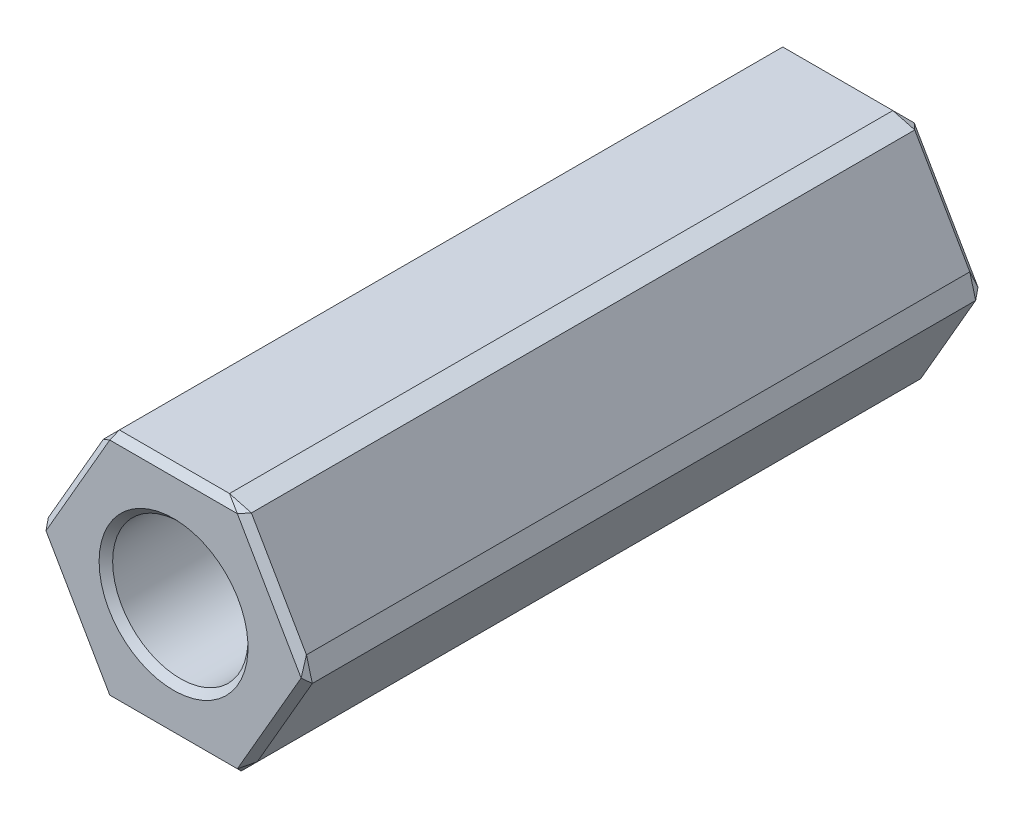
ISO-10303-21;
HEADER;
FILE_DESCRIPTION(('STEP AP214'),'2;1');
FILE_NAME('part.step','',(''),(''),'','','');
FILE_SCHEMA(('AUTOMOTIVE_DESIGN { 1 0 10303 214 1 1 1 1 }'));
ENDSEC;
DATA;
#1=APPLICATION_CONTEXT('core data for automotive mechanical design processes');
#2=APPLICATION_PROTOCOL_DEFINITION('international standard','automotive_design',2000,#1);
#3=PRODUCT_CONTEXT('',#1,'mechanical');
#4=PRODUCT('Part','Part','',(#3));
#5=PRODUCT_RELATED_PRODUCT_CATEGORY('part','',(#4));
#6=PRODUCT_DEFINITION_FORMATION('','',#4);
#7=PRODUCT_DEFINITION_CONTEXT('part definition',#1,'design');
#8=PRODUCT_DEFINITION('design','',#6,#7);
#9=PRODUCT_DEFINITION_SHAPE('','',#8);
#10=(LENGTH_UNIT() NAMED_UNIT(*) SI_UNIT(.MILLI.,.METRE.));
#11=(NAMED_UNIT(*) PLANE_ANGLE_UNIT() SI_UNIT($,.RADIAN.));
#12=(NAMED_UNIT(*) SI_UNIT($,.STERADIAN.) SOLID_ANGLE_UNIT());
#13=UNCERTAINTY_MEASURE_WITH_UNIT(LENGTH_MEASURE(1.E-05),#10,'distance_accuracy_value','');
#14=(GEOMETRIC_REPRESENTATION_CONTEXT(3) GLOBAL_UNCERTAINTY_ASSIGNED_CONTEXT((#13)) GLOBAL_UNIT_ASSIGNED_CONTEXT((#10,
#11,#12)) REPRESENTATION_CONTEXT('',''));
#15=CARTESIAN_POINT('',(0.,0.,0.));
#16=DIRECTION('',(0.,0.,1.));
#17=DIRECTION('',(1.,0.,0.));
#18=AXIS2_PLACEMENT_3D('',#15,#16,#17);
#19=CARTESIAN_POINT('',(0.,0.,20.));
#20=DIRECTION('',(0.,0.,-1.));
#21=DIRECTION('',(-1.,0.,0.));
#22=AXIS2_PLACEMENT_3D('',#19,#20,#21);
#23=PLANE('',#22);
#24=CARTESIAN_POINT('',(-1.04603243970518,3.835452278919,20.));
#25=DIRECTION('',(0.,0.,-1.));
#26=DIRECTION('',(-1.,0.,0.));
#27=AXIS2_PLACEMENT_3D('',#24,#25,#26);
#28=CIRCLE('',#27,2.20000000000001);
#29=CARTESIAN_POINT('',(-3.24603243970519,3.835452278919,20.));
#30=VERTEX_POINT('',#29);
#31=EDGE_CURVE('E11',#30,#30,#28,.T.);
#32=ORIENTED_EDGE('',*,*,#31,.T.);
#33=EDGE_LOOP('',(#32));
#34=FACE_BOUND('',#33,.T.);
#35=DIRECTION('',(-0.500000000000002,-0.866025403784437,0.));
#36=VECTOR('',#35,1.);
#37=CARTESIAN_POINT('',(-5.27211880329538,3.04385921028229,20.));
#38=LINE('',#37,#36);
#39=CARTESIAN_POINT('',(-2.93056238586724,7.09955389405677,20.));
#40=VERTEX_POINT('',#39);
#41=CARTESIAN_POINT('',(-4.81509233202933,3.835452278919,20.));
#42=VERTEX_POINT('',#41);
#43=EDGE_CURVE('E52',#40,#42,#38,.T.);
#44=ORIENTED_EDGE('',*,*,#43,.T.);
#45=DIRECTION('',(0.5,-0.866025403784439,0.));
#46=VECTOR('',#45,1.);
#47=CARTESIAN_POINT('',(-1.95051969474861,-1.12613307082278,20.));
#48=LINE('',#47,#46);
#49=CARTESIAN_POINT('',(-2.93056238586726,0.571350663781245,20.));
#50=VERTEX_POINT('',#49);
#51=EDGE_CURVE('E44',#42,#50,#48,.T.);
#52=ORIENTED_EDGE('',*,*,#51,.T.);
#53=DIRECTION('',(1.,0.,0.));
#54=VECTOR('',#53,1.);
#55=CARTESIAN_POINT('',(0.,0.571350663781246,20.));
#56=LINE('',#55,#54);
#57=CARTESIAN_POINT('',(0.838497506456868,0.571350663781247,20.));
#58=VERTEX_POINT('',#57);
#59=EDGE_CURVE('E269',#50,#58,#56,.T.);
#60=ORIENTED_EDGE('',*,*,#59,.T.);
#61=DIRECTION('',(0.500000000000006,0.866025403784435,0.));
#62=VECTOR('',#61,1.);
#63=CARTESIAN_POINT('',(0.381471035190813,-0.220242404855465,20.));
#64=LINE('',#63,#62);
#65=CARTESIAN_POINT('',(2.72302745261897,3.835452278919,20.));
#66=VERTEX_POINT('',#65);
#67=EDGE_CURVE('E271',#58,#66,#64,.T.);
#68=ORIENTED_EDGE('',*,*,#67,.T.);
#69=DIRECTION('',(-0.5,0.866025403784439,0.));
#70=VECTOR('',#69,1.);
#71=CARTESIAN_POINT('',(3.70307014373762,2.13796854431498,20.));
#72=LINE('',#71,#70);
#73=CARTESIAN_POINT('',(0.838497506456899,7.09955389405675,20.));
#74=VERTEX_POINT('',#73);
#75=EDGE_CURVE('E273',#66,#74,#72,.T.);
#76=ORIENTED_EDGE('',*,*,#75,.T.);
#77=DIRECTION('',(-1.,0.,0.));
#78=VECTOR('',#77,1.);
#79=CARTESIAN_POINT('',(0.,7.09955389405676,20.));
#80=LINE('',#79,#78);
#81=EDGE_CURVE('E57',#74,#40,#80,.T.);
#82=ORIENTED_EDGE('',*,*,#81,.T.);
#83=EDGE_LOOP('',(#44,#52,#60,#68,#76,#82));
#84=FACE_BOUND('',#83,.T.);
#85=ADVANCED_FACE('F35',(#34,#84),#23,.F.);
#86=CARTESIAN_POINT('',(0.,0.,0.));
#87=DIRECTION('',(0.,0.,-1.));
#88=DIRECTION('',(-1.,0.,0.));
#89=AXIS2_PLACEMENT_3D('',#86,#87,#88);
#90=PLANE('',#89);
#91=CARTESIAN_POINT('',(-1.04603243970518,3.835452278919,0.));
#92=DIRECTION('',(0.,0.,-1.));
#93=DIRECTION('',(-1.,0.,0.));
#94=AXIS2_PLACEMENT_3D('',#91,#92,#93);
#95=CIRCLE('',#94,2.2);
#96=CARTESIAN_POINT('',(-3.24603243970518,3.835452278919,0.));
#97=VERTEX_POINT('',#96);
#98=EDGE_CURVE('E207',#97,#97,#95,.F.);
#99=ORIENTED_EDGE('',*,*,#98,.T.);
#100=EDGE_LOOP('',(#99));
#101=FACE_BOUND('',#100,.T.);
#102=DIRECTION('',(0.500000000000002,0.866025403784437,0.));
#103=VECTOR('',#102,1.);
#104=CARTESIAN_POINT('',(-2.87282735894827,7.19955389405677,0.));
#105=LINE('',#104,#103);
#106=CARTESIAN_POINT('',(-4.81509233202933,3.835452278919,0.));
#107=VERTEX_POINT('',#106);
#108=CARTESIAN_POINT('',(-2.93056238586724,7.09955389405677,0.));
#109=VERTEX_POINT('',#108);
#110=EDGE_CURVE('E165',#107,#109,#105,.T.);
#111=ORIENTED_EDGE('',*,*,#110,.T.);
#112=DIRECTION('',(1.,0.,0.));
#113=VECTOR('',#112,1.);
#114=CARTESIAN_POINT('',(0.953967560294823,7.09955389405675,0.));
#115=LINE('',#114,#113);
#116=CARTESIAN_POINT('',(0.838497506456898,7.09955389405675,0.));
#117=VERTEX_POINT('',#116);
#118=EDGE_CURVE('E205',#109,#117,#115,.T.);
#119=ORIENTED_EDGE('',*,*,#118,.T.);
#120=DIRECTION('',(0.5,-0.866025403784439,0.));
#121=VECTOR('',#120,1.);
#122=CARTESIAN_POINT('',(2.78076247953793,3.735452278919,0.));
#123=LINE('',#122,#121);
#124=CARTESIAN_POINT('',(2.72302745261897,3.835452278919,0.));
#125=VERTEX_POINT('',#124);
#126=EDGE_CURVE('E203',#117,#125,#123,.T.);
#127=ORIENTED_EDGE('',*,*,#126,.T.);
#128=DIRECTION('',(-0.500000000000006,-0.866025403784435,0.));
#129=VECTOR('',#128,1.);
#130=CARTESIAN_POINT('',(0.780762479537904,0.471350663781249,0.));
#131=LINE('',#130,#129);
#132=CARTESIAN_POINT('',(0.838497506456866,0.571350663781248,0.));
#133=VERTEX_POINT('',#132);
#134=EDGE_CURVE('E201',#125,#133,#131,.T.);
#135=ORIENTED_EDGE('',*,*,#134,.T.);
#136=DIRECTION('',(-1.,0.,0.));
#137=VECTOR('',#136,1.);
#138=CARTESIAN_POINT('',(-3.04603243970518,0.571350663781246,0.));
#139=LINE('',#138,#137);
#140=CARTESIAN_POINT('',(-2.93056238586726,0.571350663781246,0.));
#141=VERTEX_POINT('',#140);
#142=EDGE_CURVE('E168',#133,#141,#139,.T.);
#143=ORIENTED_EDGE('',*,*,#142,.T.);
#144=DIRECTION('',(-0.5,0.866025403784439,0.));
#145=VECTOR('',#144,1.);
#146=CARTESIAN_POINT('',(-4.87282735894829,3.935452278919,0.));
#147=LINE('',#146,#145);
#148=EDGE_CURVE('E160',#141,#107,#147,.T.);
#149=ORIENTED_EDGE('',*,*,#148,.T.);
#150=EDGE_LOOP('',(#111,#119,#127,#135,#143,#149));
#151=FACE_BOUND('',#150,.T.);
#152=ADVANCED_FACE('F162',(#101,#151),#90,.T.);
#153=CARTESIAN_POINT('',(0.953967560294791,0.371350663781248,20.));
#154=DIRECTION('',(0.,1.,0.));
#155=DIRECTION('',(-1.,0.,0.));
#156=AXIS2_PLACEMENT_3D('',#153,#154,#155);
#157=PLANE('',#156);
#158=DIRECTION('',(0.,0.,-1.));
#159=VECTOR('',#158,1.);
#160=CARTESIAN_POINT('',(-2.49962227819141,0.371350663781246,20.));
#161=LINE('',#160,#159);
#162=CARTESIAN_POINT('',(-2.49962227819141,0.371350663781246,19.8));
#163=VERTEX_POINT('',#162);
#164=CARTESIAN_POINT('',(-2.49962227819141,0.371350663781246,0.199999999999999));
#165=VERTEX_POINT('',#164);
#166=EDGE_CURVE('E245',#163,#165,#161,.T.);
#167=ORIENTED_EDGE('',*,*,#166,.T.);
#168=DIRECTION('',(1.,0.,0.));
#169=VECTOR('',#168,1.);
#170=CARTESIAN_POINT('',(0.953967560294791,0.371350663781248,0.199999999999999));
#171=LINE('',#170,#169);
#172=CARTESIAN_POINT('',(0.75396756029479,0.371350663781248,0.199999999999999));
#173=VERTEX_POINT('',#172);
#174=EDGE_CURVE('E250',#165,#173,#171,.T.);
#175=ORIENTED_EDGE('',*,*,#174,.T.);
#176=DIRECTION('',(0.,0.,1.));
#177=VECTOR('',#176,1.);
#178=CARTESIAN_POINT('',(0.75396756029479,0.371350663781248,20.));
#179=LINE('',#178,#177);
#180=CARTESIAN_POINT('',(0.75396756029479,0.371350663781248,19.8));
#181=VERTEX_POINT('',#180);
#182=EDGE_CURVE('E247',#173,#181,#179,.T.);
#183=ORIENTED_EDGE('',*,*,#182,.T.);
#184=DIRECTION('',(-1.,0.,0.));
#185=VECTOR('',#184,1.);
#186=CARTESIAN_POINT('',(0.953967560294791,0.371350663781248,19.8));
#187=LINE('',#186,#185);
#188=EDGE_CURVE('E243',#181,#163,#187,.T.);
#189=ORIENTED_EDGE('',*,*,#188,.T.);
#190=EDGE_LOOP('',(#167,#175,#183,#189));
#191=FACE_BOUND('',#190,.T.);
#192=ADVANCED_FACE('F444',(#191),#157,.F.);
#193=CARTESIAN_POINT('',(2.95396756029482,3.835452278919,20.));
#194=DIRECTION('',(-0.866025403784435,0.500000000000006,0.));
#195=DIRECTION('',(-0.500000000000006,-0.866025403784435,0.));
#196=AXIS2_PLACEMENT_3D('',#193,#194,#195);
#197=PLANE('',#196);
#198=DIRECTION('',(0.,0.,-1.));
#199=VECTOR('',#198,1.);
#200=CARTESIAN_POINT('',(1.22717264105169,0.844555744538146,20.));
#201=LINE('',#200,#199);
#202=CARTESIAN_POINT('',(1.22717264105169,0.844555744538146,19.8));
#203=VERTEX_POINT('',#202);
#204=CARTESIAN_POINT('',(1.22717264105169,0.844555744538146,0.199999999999999));
#205=VERTEX_POINT('',#204);
#206=EDGE_CURVE('E236',#203,#205,#201,.T.);
#207=ORIENTED_EDGE('',*,*,#206,.T.);
#208=DIRECTION('',(0.500000000000006,0.866025403784435,0.));
#209=VECTOR('',#208,1.);
#210=CARTESIAN_POINT('',(2.95396756029482,3.835452278919,0.199999999999999));
#211=LINE('',#210,#209);
#212=CARTESIAN_POINT('',(2.85396756029482,3.66224719816211,0.199999999999999));
#213=VERTEX_POINT('',#212);
#214=EDGE_CURVE('E241',#205,#213,#211,.T.);
#215=ORIENTED_EDGE('',*,*,#214,.T.);
#216=DIRECTION('',(0.,0.,1.));
#217=VECTOR('',#216,1.);
#218=CARTESIAN_POINT('',(2.85396756029482,3.66224719816211,20.));
#219=LINE('',#218,#217);
#220=CARTESIAN_POINT('',(2.85396756029482,3.66224719816211,19.8));
#221=VERTEX_POINT('',#220);
#222=EDGE_CURVE('E238',#213,#221,#219,.T.);
#223=ORIENTED_EDGE('',*,*,#222,.T.);
#224=DIRECTION('',(-0.500000000000006,-0.866025403784435,0.));
#225=VECTOR('',#224,1.);
#226=CARTESIAN_POINT('',(2.95396756029482,3.835452278919,19.8));
#227=LINE('',#226,#225);
#228=EDGE_CURVE('E234',#221,#203,#227,.T.);
#229=ORIENTED_EDGE('',*,*,#228,.T.);
#230=EDGE_LOOP('',(#207,#215,#223,#229));
#231=FACE_BOUND('',#230,.T.);
#232=ADVANCED_FACE('F431',(#231),#197,.F.);
#233=CARTESIAN_POINT('',(0.953967560294824,7.29955389405675,20.));
#234=DIRECTION('',(-0.866025403784439,-0.5,0.));
#235=DIRECTION('',(0.5,-0.866025403784439,0.));
#236=AXIS2_PLACEMENT_3D('',#233,#234,#235);
#237=PLANE('',#236);
#238=DIRECTION('',(0.,0.,-1.));
#239=VECTOR('',#238,1.);
#240=CARTESIAN_POINT('',(2.68076247953794,4.30865735967588,20.));
#241=LINE('',#240,#239);
#242=CARTESIAN_POINT('',(2.68076247953794,4.30865735967588,19.8));
#243=VERTEX_POINT('',#242);
#244=CARTESIAN_POINT('',(2.68076247953794,4.30865735967588,0.199999999999999));
#245=VERTEX_POINT('',#244);
#246=EDGE_CURVE('E227',#243,#245,#241,.T.);
#247=ORIENTED_EDGE('',*,*,#246,.T.);
#248=DIRECTION('',(-0.5,0.866025403784439,0.));
#249=VECTOR('',#248,1.);
#250=CARTESIAN_POINT('',(0.953967560294824,7.29955389405675,0.199999999999999));
#251=LINE('',#250,#249);
#252=CARTESIAN_POINT('',(1.05396756029482,7.12634881329986,0.199999999999999));
#253=VERTEX_POINT('',#252);
#254=EDGE_CURVE('E232',#245,#253,#251,.T.);
#255=ORIENTED_EDGE('',*,*,#254,.T.);
#256=DIRECTION('',(0.,0.,1.));
#257=VECTOR('',#256,1.);
#258=CARTESIAN_POINT('',(1.05396756029482,7.12634881329986,20.));
#259=LINE('',#258,#257);
#260=CARTESIAN_POINT('',(1.05396756029482,7.12634881329986,19.8));
#261=VERTEX_POINT('',#260);
#262=EDGE_CURVE('E229',#253,#261,#259,.T.);
#263=ORIENTED_EDGE('',*,*,#262,.T.);
#264=DIRECTION('',(0.5,-0.866025403784439,0.));
#265=VECTOR('',#264,1.);
#266=CARTESIAN_POINT('',(0.953967560294824,7.29955389405675,19.8));
#267=LINE('',#266,#265);
#268=EDGE_CURVE('E225',#261,#243,#267,.T.);
#269=ORIENTED_EDGE('',*,*,#268,.T.);
#270=EDGE_LOOP('',(#247,#255,#263,#269));
#271=FACE_BOUND('',#270,.T.);
#272=ADVANCED_FACE('F422',(#271),#237,.F.);
#273=CARTESIAN_POINT('',(-3.04603243970516,7.29955389405677,20.));
#274=DIRECTION('',(0.,-1.,0.));
#275=DIRECTION('',(1.,0.,0.));
#276=AXIS2_PLACEMENT_3D('',#273,#274,#275);
#277=PLANE('',#276);
#278=DIRECTION('',(0.,0.,-1.));
#279=VECTOR('',#278,1.);
#280=CARTESIAN_POINT('',(0.407557398781042,7.29955389405675,20.));
#281=LINE('',#280,#279);
#282=CARTESIAN_POINT('',(0.407557398781042,7.29955389405675,19.8));
#283=VERTEX_POINT('',#282);
#284=CARTESIAN_POINT('',(0.407557398781042,7.29955389405675,0.199999999999999));
#285=VERTEX_POINT('',#284);
#286=EDGE_CURVE('E220',#283,#285,#281,.T.);
#287=ORIENTED_EDGE('',*,*,#286,.T.);
#288=DIRECTION('',(-1.,0.,0.));
#289=VECTOR('',#288,1.);
#290=CARTESIAN_POINT('',(-3.04603243970516,7.29955389405677,0.199999999999999));
#291=LINE('',#290,#289);
#292=CARTESIAN_POINT('',(-2.84603243970516,7.29955389405677,0.199999999999999));
#293=VERTEX_POINT('',#292);
#294=EDGE_CURVE('E223',#285,#293,#291,.T.);
#295=ORIENTED_EDGE('',*,*,#294,.T.);
#296=DIRECTION('',(0.,0.,1.));
#297=VECTOR('',#296,1.);
#298=CARTESIAN_POINT('',(-2.84603243970516,7.29955389405677,20.));
#299=LINE('',#298,#297);
#300=CARTESIAN_POINT('',(-2.84603243970516,7.29955389405677,19.8));
#301=VERTEX_POINT('',#300);
#302=EDGE_CURVE('E218',#293,#301,#299,.T.);
#303=ORIENTED_EDGE('',*,*,#302,.T.);
#304=DIRECTION('',(1.,0.,0.));
#305=VECTOR('',#304,1.);
#306=CARTESIAN_POINT('',(-3.04603243970516,7.29955389405677,19.8));
#307=LINE('',#306,#305);
#308=EDGE_CURVE('E216',#301,#283,#307,.T.);
#309=ORIENTED_EDGE('',*,*,#308,.T.);
#310=EDGE_LOOP('',(#287,#295,#303,#309));
#311=FACE_BOUND('',#310,.T.);
#312=ADVANCED_FACE('F497',(#311),#277,.F.);
#313=CARTESIAN_POINT('',(-5.04603243970518,3.835452278919,20.));
#314=DIRECTION('',(0.866025403784437,-0.500000000000002,0.));
#315=DIRECTION('',(0.500000000000002,0.866025403784437,0.));
#316=AXIS2_PLACEMENT_3D('',#313,#314,#315);
#317=PLANE('',#316);
#318=DIRECTION('',(0.,0.,-1.));
#319=VECTOR('',#318,1.);
#320=CARTESIAN_POINT('',(-3.31923752046205,6.82634881329988,20.));
#321=LINE('',#320,#319);
#322=CARTESIAN_POINT('',(-3.31923752046205,6.82634881329988,19.8));
#323=VERTEX_POINT('',#322);
#324=CARTESIAN_POINT('',(-3.31923752046205,6.82634881329988,0.199999999999999));
#325=VERTEX_POINT('',#324);
#326=EDGE_CURVE('E264',#323,#325,#321,.T.);
#327=ORIENTED_EDGE('',*,*,#326,.T.);
#328=DIRECTION('',(-0.500000000000002,-0.866025403784437,0.));
#329=VECTOR('',#328,1.);
#330=CARTESIAN_POINT('',(-5.04603243970518,3.835452278919,0.199999999999999));
#331=LINE('',#330,#329);
#332=CARTESIAN_POINT('',(-4.94603243970518,4.00865735967589,0.199999999999999));
#333=VERTEX_POINT('',#332);
#334=EDGE_CURVE('E267',#325,#333,#331,.T.);
#335=ORIENTED_EDGE('',*,*,#334,.T.);
#336=DIRECTION('',(0.,0.,1.));
#337=VECTOR('',#336,1.);
#338=CARTESIAN_POINT('',(-4.94603243970518,4.00865735967589,20.));
#339=LINE('',#338,#337);
#340=CARTESIAN_POINT('',(-4.94603243970518,4.00865735967589,19.8));
#341=VERTEX_POINT('',#340);
#342=EDGE_CURVE('E262',#333,#341,#339,.T.);
#343=ORIENTED_EDGE('',*,*,#342,.T.);
#344=DIRECTION('',(0.500000000000002,0.866025403784437,0.));
#345=VECTOR('',#344,1.);
#346=CARTESIAN_POINT('',(-5.04603243970518,3.835452278919,19.8));
#347=LINE('',#346,#345);
#348=EDGE_CURVE('E260',#341,#323,#347,.T.);
#349=ORIENTED_EDGE('',*,*,#348,.T.);
#350=EDGE_LOOP('',(#327,#335,#343,#349));
#351=FACE_BOUND('',#350,.T.);
#352=ADVANCED_FACE('F391',(#351),#317,.F.);
#353=CARTESIAN_POINT('',(-3.04603243970518,0.371350663781246,20.));
#354=DIRECTION('',(0.866025403784439,0.5,0.));
#355=DIRECTION('',(-0.5,0.866025403784439,0.));
#356=AXIS2_PLACEMENT_3D('',#353,#354,#355);
#357=PLANE('',#356);
#358=DIRECTION('',(0.,0.,-1.));
#359=VECTOR('',#358,1.);
#360=CARTESIAN_POINT('',(-4.7728273589483,3.36224719816212,20.));
#361=LINE('',#360,#359);
#362=CARTESIAN_POINT('',(-4.7728273589483,3.36224719816212,19.8));
#363=VERTEX_POINT('',#362);
#364=CARTESIAN_POINT('',(-4.7728273589483,3.36224719816212,0.199999999999999));
#365=VERTEX_POINT('',#364);
#366=EDGE_CURVE('E254',#363,#365,#361,.T.);
#367=ORIENTED_EDGE('',*,*,#366,.T.);
#368=DIRECTION('',(0.5,-0.866025403784439,0.));
#369=VECTOR('',#368,1.);
#370=CARTESIAN_POINT('',(-3.04603243970518,0.371350663781246,0.199999999999999));
#371=LINE('',#370,#369);
#372=CARTESIAN_POINT('',(-3.14603243970518,0.544555744538133,0.199999999999999));
#373=VERTEX_POINT('',#372);
#374=EDGE_CURVE('E178',#365,#373,#371,.T.);
#375=ORIENTED_EDGE('',*,*,#374,.T.);
#376=DIRECTION('',(0.,0.,1.));
#377=VECTOR('',#376,1.);
#378=CARTESIAN_POINT('',(-3.14603243970518,0.544555744538133,20.));
#379=LINE('',#378,#377);
#380=CARTESIAN_POINT('',(-3.14603243970518,0.544555744538133,19.8));
#381=VERTEX_POINT('',#380);
#382=EDGE_CURVE('E256',#373,#381,#379,.T.);
#383=ORIENTED_EDGE('',*,*,#382,.T.);
#384=DIRECTION('',(-0.5,0.866025403784439,0.));
#385=VECTOR('',#384,1.);
#386=CARTESIAN_POINT('',(-3.04603243970518,0.371350663781246,19.8));
#387=LINE('',#386,#385);
#388=EDGE_CURVE('E252',#381,#363,#387,.T.);
#389=ORIENTED_EDGE('',*,*,#388,.T.);
#390=EDGE_LOOP('',(#367,#375,#383,#389));
#391=FACE_BOUND('',#390,.T.);
#392=ADVANCED_FACE('F372',(#391),#357,.F.);
#393=CARTESIAN_POINT('',(-1.04603243970518,3.835452278919,20.));
#394=DIRECTION('',(0.,0.,-1.));
#395=DIRECTION('',(-1.,0.,0.));
#396=AXIS2_PLACEMENT_3D('',#393,#394,#395);
#397=CYLINDRICAL_SURFACE('',#396,2.);
#398=CARTESIAN_POINT('',(-1.04603243970518,3.835452278919,0.199999999999995));
#399=DIRECTION('',(0.,0.,-1.));
#400=DIRECTION('',(-1.,0.,0.));
#401=AXIS2_PLACEMENT_3D('',#398,#399,#400);
#402=CIRCLE('',#401,2.);
#403=CARTESIAN_POINT('',(-3.04603243970519,3.835452278919,0.199999999999995));
#404=VERTEX_POINT('',#403);
#405=EDGE_CURVE('E213',#404,#404,#402,.T.);
#406=ORIENTED_EDGE('',*,*,#405,.T.);
#407=EDGE_LOOP('',(#406));
#408=FACE_BOUND('',#407,.T.);
#409=CARTESIAN_POINT('',(-1.04603243970518,3.835452278919,19.8));
#410=DIRECTION('',(0.,0.,-1.));
#411=DIRECTION('',(-1.,0.,0.));
#412=AXIS2_PLACEMENT_3D('',#409,#410,#411);
#413=CIRCLE('',#412,2.);
#414=CARTESIAN_POINT('',(-3.04603243970519,3.835452278919,19.8));
#415=VERTEX_POINT('',#414);
#416=EDGE_CURVE('E210',#415,#415,#413,.F.);
#417=ORIENTED_EDGE('',*,*,#416,.T.);
#418=EDGE_LOOP('',(#417));
#419=FACE_BOUND('',#418,.T.);
#420=ADVANCED_FACE('F491',(#408,#419),#397,.F.);
#421=CARTESIAN_POINT('',(-1.04603243970518,3.835452278919,0.));
#422=DIRECTION('',(0.,0.,-1.));
#423=DIRECTION('',(-1.,0.,0.));
#424=AXIS2_PLACEMENT_3D('',#421,#422,#423);
#425=CONICAL_SURFACE('',#424,2.2,0.785398163397446);
#426=ORIENTED_EDGE('',*,*,#405,.F.);
#427=EDGE_LOOP('',(#426));
#428=FACE_BOUND('',#427,.T.);
#429=ORIENTED_EDGE('',*,*,#98,.F.);
#430=EDGE_LOOP('',(#429));
#431=FACE_BOUND('',#430,.T.);
#432=ADVANCED_FACE('F507',(#428,#431),#425,.F.);
#433=CARTESIAN_POINT('',(-2.49962227819141,0.371350663781246,20.));
#434=DIRECTION('',(0.258819045102522,0.965925826289068,0.));
#435=DIRECTION('',(0.,0.,-1.));
#436=AXIS2_PLACEMENT_3D('',#433,#434,#435);
#437=PLANE('',#436);
#438=DIRECTION('',(-0.965925826289068,0.258819045102522,0.));
#439=VECTOR('',#438,1.);
#440=CARTESIAN_POINT('',(-3.14603243970518,0.544555744538133,19.8));
#441=LINE('',#440,#439);
#442=EDGE_CURVE('E39',#381,#163,#441,.F.);
#443=ORIENTED_EDGE('',*,*,#442,.F.);
#444=ORIENTED_EDGE('',*,*,#382,.F.);
#445=DIRECTION('',(0.965925826289068,-0.258819045102522,0.));
#446=VECTOR('',#445,1.);
#447=CARTESIAN_POINT('',(-2.49962227819141,0.371350663781246,0.199999999999999));
#448=LINE('',#447,#446);
#449=EDGE_CURVE('E198',#165,#373,#448,.F.);
#450=ORIENTED_EDGE('',*,*,#449,.F.);
#451=ORIENTED_EDGE('',*,*,#166,.F.);
#452=EDGE_LOOP('',(#443,#444,#450,#451));
#453=FACE_BOUND('',#452,.T.);
#454=ADVANCED_FACE('F370',(#453),#437,.F.);
#455=CARTESIAN_POINT('',(-3.14603243970518,0.544555744538133,19.8));
#456=DIRECTION('',(-0.239619874159853,-0.894273544867829,0.377964473009228));
#457=DIRECTION('',(0.,-0.389306214312519,-0.921108392914566));
#458=AXIS2_PLACEMENT_3D('',#455,#456,#457);
#459=PLANE('',#458);
#460=DIRECTION('',(0.729902592366237,0.0907675134870614,0.677497944020809));
#461=VECTOR('',#460,1.);
#462=CARTESIAN_POINT('',(-3.14603243970518,0.544555744538132,19.8));
#463=LINE('',#462,#461);
#464=EDGE_CURVE('E354',#381,#50,#463,.T.);
#465=ORIENTED_EDGE('',*,*,#464,.F.);
#466=ORIENTED_EDGE('',*,*,#442,.T.);
#467=DIRECTION('',(0.836013856609692,-0.387995381130104,-0.387995381130104));
#468=VECTOR('',#467,1.);
#469=CARTESIAN_POINT('',(-3.0075931787777,0.607100779186323,20.0357501154051));
#470=LINE('',#469,#468);
#471=EDGE_CURVE('E357',#50,#163,#470,.T.);
#472=ORIENTED_EDGE('',*,*,#471,.F.);
#473=EDGE_LOOP('',(#465,#466,#472));
#474=FACE_BOUND('',#473,.T.);
#475=ADVANCED_FACE('F452',(#474),#459,.T.);
#476=CARTESIAN_POINT('',(-2.49962227819141,0.371350663781246,0.199999999999999));
#477=DIRECTION('',(-0.239619874159852,-0.894273544867826,-0.377964473009235));
#478=DIRECTION('',(0.,0.389306214312527,-0.921108392914563));
#479=AXIS2_PLACEMENT_3D('',#476,#477,#478);
#480=PLANE('',#479);
#481=DIRECTION('',(0.83601385660969,-0.387995381130107,0.387995381130105));
#482=VECTOR('',#481,1.);
#483=CARTESIAN_POINT('',(-2.49962227819141,0.371350663781246,0.199999999999999));
#484=LINE('',#483,#482);
#485=EDGE_CURVE('E350',#165,#141,#484,.F.);
#486=ORIENTED_EDGE('',*,*,#485,.F.);
#487=ORIENTED_EDGE('',*,*,#449,.T.);
#488=DIRECTION('',(0.729902592366237,0.0907675134870671,-0.677497944020808));
#489=VECTOR('',#488,1.);
#490=CARTESIAN_POINT('',(-2.81312747442005,0.585954358877166,-0.10900346415242));
#491=LINE('',#490,#489);
#492=EDGE_CURVE('E352',#141,#373,#491,.F.);
#493=ORIENTED_EDGE('',*,*,#492,.F.);
#494=EDGE_LOOP('',(#486,#487,#493));
#495=FACE_BOUND('',#494,.T.);
#496=ADVANCED_FACE('F364',(#495),#480,.T.);
#497=CARTESIAN_POINT('',(0.,0.571350663781246,20.));
#498=DIRECTION('',(0.,0.707106781186548,-0.707106781186548));
#499=DIRECTION('',(1.,0.,0.));
#500=AXIS2_PLACEMENT_3D('',#497,#498,#499);
#501=PLANE('',#500);
#502=ORIENTED_EDGE('',*,*,#471,.T.);
#503=ORIENTED_EDGE('',*,*,#188,.F.);
#504=DIRECTION('',(0.286344323664988,0.677497944020807,0.677497944020807));
#505=VECTOR('',#504,1.);
#506=CARTESIAN_POINT('',(0.75396756029479,0.371350663781248,19.8));
#507=LINE('',#506,#505);
#508=EDGE_CURVE('E345',#58,#181,#507,.F.);
#509=ORIENTED_EDGE('',*,*,#508,.F.);
#510=ORIENTED_EDGE('',*,*,#59,.F.);
#511=EDGE_LOOP('',(#502,#503,#509,#510));
#512=FACE_BOUND('',#511,.T.);
#513=ADVANCED_FACE('F448',(#512),#501,.F.);
#514=CARTESIAN_POINT('',(-1.95051969474861,-1.12613307082278,20.));
#515=DIRECTION('',(0.612372435695795,0.353553390593274,-0.707106781186547));
#516=DIRECTION('',(0.5,-0.866025403784439,0.));
#517=AXIS2_PLACEMENT_3D('',#514,#515,#516);
#518=PLANE('',#517);
#519=ORIENTED_EDGE('',*,*,#464,.T.);
#520=ORIENTED_EDGE('',*,*,#51,.F.);
#521=DIRECTION('',(0.0819930716951482,-0.918006928304846,-0.387995381130106));
#522=VECTOR('',#521,1.);
#523=CARTESIAN_POINT('',(-4.82264722035553,3.92003796015564,20.0357501154051));
#524=LINE('',#523,#522);
#525=EDGE_CURVE('E342',#363,#42,#524,.F.);
#526=ORIENTED_EDGE('',*,*,#525,.F.);
#527=ORIENTED_EDGE('',*,*,#388,.F.);
#528=EDGE_LOOP('',(#519,#520,#526,#527));
#529=FACE_BOUND('',#528,.T.);
#530=ADVANCED_FACE('F381',(#529),#518,.F.);
#531=CARTESIAN_POINT('',(-4.7728273589483,3.36224719816212,20.));
#532=DIRECTION('',(0.965925826289069,0.258819045102517,0.));
#533=DIRECTION('',(0.,0.,-1.));
#534=AXIS2_PLACEMENT_3D('',#531,#532,#533);
#535=PLANE('',#534);
#536=DIRECTION('',(0.258819045102517,-0.965925826289069,0.));
#537=VECTOR('',#536,1.);
#538=CARTESIAN_POINT('',(-4.7728273589483,3.36224719816212,0.199999999999998));
#539=LINE('',#538,#537);
#540=EDGE_CURVE('E182',#365,#333,#539,.F.);
#541=ORIENTED_EDGE('',*,*,#540,.F.);
#542=ORIENTED_EDGE('',*,*,#366,.F.);
#543=DIRECTION('',(-0.258819045102517,0.965925826289069,0.));
#544=VECTOR('',#543,1.);
#545=CARTESIAN_POINT('',(-4.94603243970518,4.00865735967589,19.8));
#546=LINE('',#545,#544);
#547=EDGE_CURVE('E339',#341,#363,#546,.F.);
#548=ORIENTED_EDGE('',*,*,#547,.F.);
#549=ORIENTED_EDGE('',*,*,#342,.F.);
#550=EDGE_LOOP('',(#541,#542,#548,#549));
#551=FACE_BOUND('',#550,.T.);
#552=ADVANCED_FACE('F377',(#551),#535,.F.);
#553=CARTESIAN_POINT('',(-3.04603243970518,0.371350663781246,0.199999999999999));
#554=DIRECTION('',(-0.612372435695793,-0.353553390593272,-0.70710678118655));
#555=DIRECTION('',(-0.5,0.866025403784439,0.));
#556=AXIS2_PLACEMENT_3D('',#553,#554,#555);
#557=PLANE('',#556);
#558=ORIENTED_EDGE('',*,*,#492,.T.);
#559=ORIENTED_EDGE('',*,*,#374,.F.);
#560=DIRECTION('',(0.0819930716951445,-0.918006928304846,0.387995381130106));
#561=VECTOR('',#560,1.);
#562=CARTESIAN_POINT('',(-4.7728273589483,3.36224719816212,0.199999999999999));
#563=LINE('',#562,#561);
#564=EDGE_CURVE('E175',#107,#365,#563,.T.);
#565=ORIENTED_EDGE('',*,*,#564,.F.);
#566=ORIENTED_EDGE('',*,*,#148,.F.);
#567=EDGE_LOOP('',(#558,#559,#565,#566));
#568=FACE_BOUND('',#567,.T.);
#569=ADVANCED_FACE('F177',(#568),#557,.T.);
#570=CARTESIAN_POINT('',(0.953967560294791,0.371350663781248,0.199999999999999));
#571=DIRECTION('',(0.,-0.707106781186545,-0.70710678118655));
#572=DIRECTION('',(-1.,0.,0.));
#573=AXIS2_PLACEMENT_3D('',#570,#571,#572);
#574=PLANE('',#573);
#575=ORIENTED_EDGE('',*,*,#485,.T.);
#576=ORIENTED_EDGE('',*,*,#142,.F.);
#577=DIRECTION('',(0.286344323664983,0.67749794402081,-0.677497944020805));
#578=VECTOR('',#577,1.);
#579=CARTESIAN_POINT('',(0.884567791238291,0.680354127933681,-0.109003464152432));
#580=LINE('',#579,#578);
#581=EDGE_CURVE('E183',#173,#133,#580,.T.);
#582=ORIENTED_EDGE('',*,*,#581,.F.);
#583=ORIENTED_EDGE('',*,*,#174,.F.);
#584=EDGE_LOOP('',(#575,#576,#582,#583));
#585=FACE_BOUND('',#584,.T.);
#586=ADVANCED_FACE('F442',(#585),#574,.T.);
#587=CARTESIAN_POINT('',(1.22717264105169,0.844555744538146,20.));
#588=DIRECTION('',(-0.707106781186547,0.707106781186548,0.));
#589=DIRECTION('',(0.,0.,-1.));
#590=AXIS2_PLACEMENT_3D('',#587,#588,#589);
#591=PLANE('',#590);
#592=DIRECTION('',(-0.707106781186548,-0.707106781186547,0.));
#593=VECTOR('',#592,1.);
#594=CARTESIAN_POINT('',(0.75396756029479,0.371350663781248,19.8));
#595=LINE('',#594,#593);
#596=EDGE_CURVE('E347',#181,#203,#595,.F.);
#597=ORIENTED_EDGE('',*,*,#596,.F.);
#598=ORIENTED_EDGE('',*,*,#182,.F.);
#599=DIRECTION('',(0.707106781186548,0.707106781186547,0.));
#600=VECTOR('',#599,1.);
#601=CARTESIAN_POINT('',(1.22717264105169,0.844555744538146,0.199999999999999));
#602=LINE('',#601,#600);
#603=EDGE_CURVE('E333',#205,#173,#602,.F.);
#604=ORIENTED_EDGE('',*,*,#603,.F.);
#605=ORIENTED_EDGE('',*,*,#206,.F.);
#606=EDGE_LOOP('',(#597,#598,#604,#605));
#607=FACE_BOUND('',#606,.T.);
#608=ADVANCED_FACE('F437',(#607),#591,.F.);
#609=CARTESIAN_POINT('',(0.75396756029479,0.371350663781248,19.8));
#610=DIRECTION('',(0.654653670707979,-0.65465367070798,0.377964473009218));
#611=DIRECTION('',(0.707106781186548,0.707106781186547,0.));
#612=AXIS2_PLACEMENT_3D('',#609,#610,#611);
#613=PLANE('',#612);
#614=ORIENTED_EDGE('',*,*,#508,.T.);
#615=ORIENTED_EDGE('',*,*,#596,.T.);
#616=DIRECTION('',(0.754020784914539,0.530011547174755,-0.387995381130091));
#617=VECTOR('',#616,1.);
#618=CARTESIAN_POINT('',(0.769021601872618,0.522515097949679,20.0357501154051));
#619=LINE('',#618,#617);
#620=EDGE_CURVE('E330',#58,#203,#619,.T.);
#621=ORIENTED_EDGE('',*,*,#620,.F.);
#622=EDGE_LOOP('',(#614,#615,#621));
#623=FACE_BOUND('',#622,.T.);
#624=ADVANCED_FACE('F663',(#623),#613,.T.);
#625=CARTESIAN_POINT('',(-4.94603243970518,4.00865735967589,19.8));
#626=DIRECTION('',(-0.894273544867831,-0.239619874159849,0.377964473009226));
#627=DIRECTION('',(0.389306214312517,0.,0.921108392914567));
#628=AXIS2_PLACEMENT_3D('',#625,#626,#627);
#629=PLANE('',#628);
#630=ORIENTED_EDGE('',*,*,#547,.T.);
#631=ORIENTED_EDGE('',*,*,#525,.T.);
#632=DIRECTION('',(0.443558268701257,-0.58673043053375,0.67749794402081));
#633=VECTOR('',#632,1.);
#634=CARTESIAN_POINT('',(-4.94603243970518,4.00865735967589,19.8));
#635=LINE('',#634,#633);
#636=EDGE_CURVE('E190',#341,#42,#635,.T.);
#637=ORIENTED_EDGE('',*,*,#636,.F.);
#638=EDGE_LOOP('',(#630,#631,#637));
#639=FACE_BOUND('',#638,.T.);
#640=ADVANCED_FACE('F384',(#639),#629,.T.);
#641=CARTESIAN_POINT('',(-4.7728273589483,3.36224719816212,0.199999999999999));
#642=DIRECTION('',(-0.894273544867828,-0.239619874159848,-0.377964473009233));
#643=DIRECTION('',(-0.389306214312524,0.,0.921108392914564));
#644=AXIS2_PLACEMENT_3D('',#641,#642,#643);
#645=PLANE('',#644);
#646=ORIENTED_EDGE('',*,*,#564,.T.);
#647=ORIENTED_EDGE('',*,*,#540,.T.);
#648=DIRECTION('',(0.443558268701262,-0.586730430533749,-0.677497944020807));
#649=VECTOR('',#648,1.);
#650=CARTESIAN_POINT('',(-4.74372770536354,3.7410525098625,-0.10900346415242));
#651=LINE('',#650,#649);
#652=EDGE_CURVE('E186',#107,#333,#651,.F.);
#653=ORIENTED_EDGE('',*,*,#652,.F.);
#654=EDGE_LOOP('',(#646,#647,#653));
#655=FACE_BOUND('',#654,.T.);
#656=ADVANCED_FACE('F187',(#655),#645,.T.);
#657=CARTESIAN_POINT('',(1.22717264105169,0.844555744538146,0.199999999999999));
#658=DIRECTION('',(0.654653670707977,-0.654653670707978,-0.377964473009226));
#659=DIRECTION('',(0.707106781186548,0.707106781186547,0.));
#660=AXIS2_PLACEMENT_3D('',#657,#658,#659);
#661=PLANE('',#660);
#662=ORIENTED_EDGE('',*,*,#603,.T.);
#663=ORIENTED_EDGE('',*,*,#581,.T.);
#664=DIRECTION('',(0.754020784914541,0.530011547174752,0.38799538113009));
#665=VECTOR('',#664,1.);
#666=CARTESIAN_POINT('',(1.22717264105169,0.844555744538146,0.199999999999999));
#667=LINE('',#666,#665);
#668=EDGE_CURVE('E191',#205,#133,#667,.F.);
#669=ORIENTED_EDGE('',*,*,#668,.F.);
#670=EDGE_LOOP('',(#662,#663,#669));
#671=FACE_BOUND('',#670,.T.);
#672=ADVANCED_FACE('F440',(#671),#661,.T.);
#673=CARTESIAN_POINT('',(0.381471035190813,-0.220242404855465,20.));
#674=DIRECTION('',(-0.612372435695793,0.353553390593279,-0.707106781186546));
#675=DIRECTION('',(0.500000000000006,0.866025403784435,0.));
#676=AXIS2_PLACEMENT_3D('',#673,#674,#675);
#677=PLANE('',#676);
#678=ORIENTED_EDGE('',*,*,#620,.T.);
#679=ORIENTED_EDGE('',*,*,#228,.F.);
#680=DIRECTION('',(-0.443558268701249,0.586730430533757,0.677497944020809));
#681=VECTOR('',#680,1.);
#682=CARTESIAN_POINT('',(2.85396756029482,3.66224719816211,19.8));
#683=LINE('',#682,#681);
#684=EDGE_CURVE('E321',#66,#221,#683,.F.);
#685=ORIENTED_EDGE('',*,*,#684,.F.);
#686=ORIENTED_EDGE('',*,*,#67,.F.);
#687=EDGE_LOOP('',(#678,#679,#685,#686));
#688=FACE_BOUND('',#687,.T.);
#689=ADVANCED_FACE('F458',(#688),#677,.F.);
#690=CARTESIAN_POINT('',(-5.27211880329538,3.04385921028229,20.));
#691=DIRECTION('',(0.612372435695794,-0.353553390593276,-0.707106781186547));
#692=DIRECTION('',(-0.500000000000002,-0.866025403784437,0.));
#693=AXIS2_PLACEMENT_3D('',#690,#691,#692);
#694=PLANE('',#693);
#695=ORIENTED_EDGE('',*,*,#636,.T.);
#696=ORIENTED_EDGE('',*,*,#43,.F.);
#697=DIRECTION('',(-0.75402078491454,-0.530011547174749,-0.387995381130098));
#698=VECTOR('',#697,1.);
#699=CARTESIAN_POINT('',(-2.86108648128299,7.14838945988833,20.0357501154051));
#700=LINE('',#699,#698);
#701=EDGE_CURVE('E318',#323,#40,#700,.F.);
#702=ORIENTED_EDGE('',*,*,#701,.F.);
#703=ORIENTED_EDGE('',*,*,#348,.F.);
#704=EDGE_LOOP('',(#695,#696,#702,#703));
#705=FACE_BOUND('',#704,.T.);
#706=ADVANCED_FACE('F388',(#705),#694,.F.);
#707=CARTESIAN_POINT('',(-3.31923752046205,6.82634881329988,20.));
#708=DIRECTION('',(0.707106781186545,-0.70710678118655,0.));
#709=DIRECTION('',(0.,0.,-1.));
#710=AXIS2_PLACEMENT_3D('',#707,#708,#709);
#711=PLANE('',#710);
#712=DIRECTION('',(-0.70710678118655,-0.707106781186545,0.));
#713=VECTOR('',#712,1.);
#714=CARTESIAN_POINT('',(-3.31923752046205,6.82634881329988,0.2));
#715=LINE('',#714,#713);
#716=EDGE_CURVE('E312',#325,#293,#715,.F.);
#717=ORIENTED_EDGE('',*,*,#716,.F.);
#718=ORIENTED_EDGE('',*,*,#326,.F.);
#719=DIRECTION('',(0.70710678118655,0.707106781186545,0.));
#720=VECTOR('',#719,1.);
#721=CARTESIAN_POINT('',(-2.84603243970516,7.29955389405677,19.8));
#722=LINE('',#721,#720);
#723=EDGE_CURVE('E315',#301,#323,#722,.F.);
#724=ORIENTED_EDGE('',*,*,#723,.F.);
#725=ORIENTED_EDGE('',*,*,#302,.F.);
#726=EDGE_LOOP('',(#717,#718,#724,#725));
#727=FACE_BOUND('',#726,.T.);
#728=ADVANCED_FACE('F395',(#727),#711,.F.);
#729=CARTESIAN_POINT('',(-5.04603243970518,3.835452278919,0.199999999999999));
#730=DIRECTION('',(-0.612372435695791,0.353553390593274,-0.70710678118655));
#731=DIRECTION('',(0.500000000000002,0.866025403784437,0.));
#732=AXIS2_PLACEMENT_3D('',#729,#730,#731);
#733=PLANE('',#732);
#734=ORIENTED_EDGE('',*,*,#652,.T.);
#735=ORIENTED_EDGE('',*,*,#334,.F.);
#736=DIRECTION('',(-0.754020784914542,-0.530011547174747,0.387995381130097));
#737=VECTOR('',#736,1.);
#738=CARTESIAN_POINT('',(-3.31923752046205,6.82634881329988,0.199999999999998));
#739=LINE('',#738,#737);
#740=EDGE_CURVE('E194',#109,#325,#739,.T.);
#741=ORIENTED_EDGE('',*,*,#740,.F.);
#742=ORIENTED_EDGE('',*,*,#110,.F.);
#743=EDGE_LOOP('',(#734,#735,#741,#742));
#744=FACE_BOUND('',#743,.T.);
#745=ADVANCED_FACE('F193',(#744),#733,.T.);
#746=CARTESIAN_POINT('',(2.95396756029482,3.835452278919,0.199999999999999));
#747=DIRECTION('',(0.61237243569579,-0.353553390593277,-0.70710678118655));
#748=DIRECTION('',(-0.500000000000006,-0.866025403784435,0.));
#749=AXIS2_PLACEMENT_3D('',#746,#747,#748);
#750=PLANE('',#749);
#751=ORIENTED_EDGE('',*,*,#668,.T.);
#752=ORIENTED_EDGE('',*,*,#134,.F.);
#753=DIRECTION('',(-0.443558268701253,0.586730430533757,-0.677497944020806));
#754=VECTOR('',#753,1.);
#755=CARTESIAN_POINT('',(2.65166282595318,3.9298520479755,-0.109003464152419));
#756=LINE('',#755,#754);
#757=EDGE_CURVE('E308',#213,#125,#756,.T.);
#758=ORIENTED_EDGE('',*,*,#757,.F.);
#759=ORIENTED_EDGE('',*,*,#214,.F.);
#760=EDGE_LOOP('',(#751,#752,#758,#759));
#761=FACE_BOUND('',#760,.T.);
#762=ADVANCED_FACE('F411',(#761),#750,.T.);
#763=CARTESIAN_POINT('',(2.68076247953794,4.30865735967587,20.));
#764=DIRECTION('',(-0.965925826289071,-0.25881904510251,0.));
#765=DIRECTION('',(0.,0.,-1.));
#766=AXIS2_PLACEMENT_3D('',#763,#764,#765);
#767=PLANE('',#766);
#768=DIRECTION('',(0.25881904510251,-0.965925826289071,0.));
#769=VECTOR('',#768,1.);
#770=CARTESIAN_POINT('',(2.85396756029482,3.66224719816211,19.8));
#771=LINE('',#770,#769);
#772=EDGE_CURVE('E323',#221,#243,#771,.F.);
#773=ORIENTED_EDGE('',*,*,#772,.F.);
#774=ORIENTED_EDGE('',*,*,#222,.F.);
#775=DIRECTION('',(-0.25881904510251,0.965925826289071,0.));
#776=VECTOR('',#775,1.);
#777=CARTESIAN_POINT('',(2.68076247953794,4.30865735967588,0.199999999999998));
#778=LINE('',#777,#776);
#779=EDGE_CURVE('E305',#245,#213,#778,.F.);
#780=ORIENTED_EDGE('',*,*,#779,.F.);
#781=ORIENTED_EDGE('',*,*,#246,.F.);
#782=EDGE_LOOP('',(#773,#774,#780,#781));
#783=FACE_BOUND('',#782,.T.);
#784=ADVANCED_FACE('F428',(#783),#767,.F.);
#785=CARTESIAN_POINT('',(2.85396756029482,3.66224719816211,19.8));
#786=DIRECTION('',(0.894273544867834,0.239619874159843,0.377964473009222));
#787=DIRECTION('',(0.389306214312511,0.,-0.921108392914569));
#788=AXIS2_PLACEMENT_3D('',#785,#786,#787);
#789=PLANE('',#788);
#790=ORIENTED_EDGE('',*,*,#684,.T.);
#791=ORIENTED_EDGE('',*,*,#772,.T.);
#792=DIRECTION('',(-0.0819930716951411,0.918006928304845,-0.38799538113011));
#793=VECTOR('',#792,1.);
#794=CARTESIAN_POINT('',(2.73058234094517,3.75086659768236,20.0357501154051));
#795=LINE('',#794,#793);
#796=EDGE_CURVE('E302',#66,#243,#795,.T.);
#797=ORIENTED_EDGE('',*,*,#796,.F.);
#798=EDGE_LOOP('',(#790,#791,#797));
#799=FACE_BOUND('',#798,.T.);
#800=ADVANCED_FACE('F460',(#799),#789,.T.);
#801=CARTESIAN_POINT('',(-2.84603243970516,7.29955389405677,19.8));
#802=DIRECTION('',(-0.654653670707978,0.654653670707983,0.377964473009217));
#803=DIRECTION('',(-0.70710678118655,-0.707106781186545,0.));
#804=AXIS2_PLACEMENT_3D('',#801,#802,#803);
#805=PLANE('',#804);
#806=ORIENTED_EDGE('',*,*,#723,.T.);
#807=ORIENTED_EDGE('',*,*,#701,.T.);
#808=DIRECTION('',(-0.286344323664991,-0.677497944020806,0.677497944020807));
#809=VECTOR('',#808,1.);
#810=CARTESIAN_POINT('',(-2.84603243970516,7.29955389405677,19.8));
#811=LINE('',#810,#809);
#812=EDGE_CURVE('E299',#301,#40,#811,.T.);
#813=ORIENTED_EDGE('',*,*,#812,.F.);
#814=EDGE_LOOP('',(#806,#807,#813));
#815=FACE_BOUND('',#814,.T.);
#816=ADVANCED_FACE('F473',(#815),#805,.T.);
#817=CARTESIAN_POINT('',(-3.31923752046205,6.82634881329988,0.199999999999999));
#818=DIRECTION('',(-0.654653670707976,0.65465367070798,-0.377964473009224));
#819=DIRECTION('',(-0.70710678118655,-0.707106781186545,0.));
#820=AXIS2_PLACEMENT_3D('',#817,#818,#819);
#821=PLANE('',#820);
#822=ORIENTED_EDGE('',*,*,#740,.T.);
#823=ORIENTED_EDGE('',*,*,#716,.T.);
#824=DIRECTION('',(-0.286344323664987,-0.677497944020809,-0.677497944020805));
#825=VECTOR('',#824,1.);
#826=CARTESIAN_POINT('',(-2.97663267064866,6.99055042990434,-0.109003464152427));
#827=LINE('',#826,#825);
#828=EDGE_CURVE('E296',#109,#293,#827,.F.);
#829=ORIENTED_EDGE('',*,*,#828,.F.);
#830=EDGE_LOOP('',(#822,#823,#829));
#831=FACE_BOUND('',#830,.T.);
#832=ADVANCED_FACE('F399',(#831),#821,.T.);
#833=CARTESIAN_POINT('',(2.68076247953794,4.30865735967588,0.199999999999999));
#834=DIRECTION('',(0.894273544867832,0.239619874159842,-0.377964473009228));
#835=DIRECTION('',(-0.389306214312518,0.,-0.921108392914567));
#836=AXIS2_PLACEMENT_3D('',#833,#834,#835);
#837=PLANE('',#836);
#838=ORIENTED_EDGE('',*,*,#779,.T.);
#839=ORIENTED_EDGE('',*,*,#757,.T.);
#840=DIRECTION('',(-0.0819930716951379,0.918006928304845,0.38799538113011));
#841=VECTOR('',#840,1.);
#842=CARTESIAN_POINT('',(2.68076247953794,4.30865735967588,0.199999999999999));
#843=LINE('',#842,#841);
#844=EDGE_CURVE('E293',#245,#125,#843,.F.);
#845=ORIENTED_EDGE('',*,*,#844,.F.);
#846=EDGE_LOOP('',(#838,#839,#845));
#847=FACE_BOUND('',#846,.T.);
#848=ADVANCED_FACE('F416',(#847),#837,.T.);
#849=CARTESIAN_POINT('',(3.70307014373762,2.13796854431498,20.));
#850=DIRECTION('',(-0.612372435695794,-0.353553390593273,-0.707106781186548));
#851=DIRECTION('',(-0.5,0.866025403784439,0.));
#852=AXIS2_PLACEMENT_3D('',#849,#850,#851);
#853=PLANE('',#852);
#854=ORIENTED_EDGE('',*,*,#796,.T.);
#855=ORIENTED_EDGE('',*,*,#268,.F.);
#856=DIRECTION('',(-0.729902592366239,-0.0907675134870553,0.677497944020807));
#857=VECTOR('',#856,1.);
#858=CARTESIAN_POINT('',(1.05396756029482,7.12634881329986,19.8));
#859=LINE('',#858,#857);
#860=EDGE_CURVE('E290',#74,#261,#859,.F.);
#861=ORIENTED_EDGE('',*,*,#860,.F.);
#862=ORIENTED_EDGE('',*,*,#75,.F.);
#863=EDGE_LOOP('',(#854,#855,#861,#862));
#864=FACE_BOUND('',#863,.T.);
#865=ADVANCED_FACE('F463',(#864),#853,.F.);
#866=CARTESIAN_POINT('',(0.,7.09955389405676,20.));
#867=DIRECTION('',(0.,-0.707106781186548,-0.707106781186547));
#868=DIRECTION('',(-1.,0.,0.));
#869=AXIS2_PLACEMENT_3D('',#866,#867,#868);
#870=PLANE('',#869);
#871=ORIENTED_EDGE('',*,*,#812,.T.);
#872=ORIENTED_EDGE('',*,*,#81,.F.);
#873=DIRECTION('',(-0.836013856609697,0.3879953811301,-0.387995381130097));
#874=VECTOR('',#873,1.);
#875=CARTESIAN_POINT('',(0.915528299367345,7.06380377865167,20.0357501154051));
#876=LINE('',#875,#874);
#877=EDGE_CURVE('E287',#283,#74,#876,.F.);
#878=ORIENTED_EDGE('',*,*,#877,.F.);
#879=ORIENTED_EDGE('',*,*,#308,.F.);
#880=EDGE_LOOP('',(#871,#872,#878,#879));
#881=FACE_BOUND('',#880,.T.);
#882=ADVANCED_FACE('F471',(#881),#870,.F.);
#883=CARTESIAN_POINT('',(-3.04603243970516,7.29955389405677,0.199999999999999));
#884=DIRECTION('',(0.,0.707106781186545,-0.70710678118655));
#885=DIRECTION('',(1.,0.,0.));
#886=AXIS2_PLACEMENT_3D('',#883,#884,#885);
#887=PLANE('',#886);
#888=ORIENTED_EDGE('',*,*,#828,.T.);
#889=ORIENTED_EDGE('',*,*,#294,.F.);
#890=DIRECTION('',(-0.836013856609696,0.387995381130103,0.387995381130097));
#891=VECTOR('',#890,1.);
#892=CARTESIAN_POINT('',(0.407557398781042,7.29955389405675,0.199999999999999));
#893=LINE('',#892,#891);
#894=EDGE_CURVE('E284',#117,#285,#893,.T.);
#895=ORIENTED_EDGE('',*,*,#894,.F.);
#896=ORIENTED_EDGE('',*,*,#118,.F.);
#897=EDGE_LOOP('',(#888,#889,#895,#896));
#898=FACE_BOUND('',#897,.T.);
#899=ADVANCED_FACE('F403',(#898),#887,.T.);
#900=CARTESIAN_POINT('',(0.953967560294824,7.29955389405675,0.199999999999999));
#901=DIRECTION('',(0.612372435695791,0.353553390593272,-0.707106781186551));
#902=DIRECTION('',(0.5,-0.866025403784439,0.));
#903=AXIS2_PLACEMENT_3D('',#900,#901,#902);
#904=PLANE('',#903);
#905=ORIENTED_EDGE('',*,*,#844,.T.);
#906=ORIENTED_EDGE('',*,*,#126,.F.);
#907=DIRECTION('',(-0.72990259236624,-0.0907675134870615,-0.677497944020805));
#908=VECTOR('',#907,1.);
#909=CARTESIAN_POINT('',(0.721062595009678,7.08495019896083,-0.109003464152427));
#910=LINE('',#909,#908);
#911=EDGE_CURVE('E282',#253,#117,#910,.T.);
#912=ORIENTED_EDGE('',*,*,#911,.F.);
#913=ORIENTED_EDGE('',*,*,#254,.F.);
#914=EDGE_LOOP('',(#905,#906,#912,#913));
#915=FACE_BOUND('',#914,.T.);
#916=ADVANCED_FACE('F419',(#915),#904,.T.);
#917=CARTESIAN_POINT('',(1.05396756029482,7.12634881329986,19.8));
#918=DIRECTION('',(0.239619874159853,0.894273544867831,0.377964473009223));
#919=DIRECTION('',(0.,-0.389306214312514,0.921108392914568));
#920=AXIS2_PLACEMENT_3D('',#917,#918,#919);
#921=PLANE('',#920);
#922=ORIENTED_EDGE('',*,*,#877,.T.);
#923=ORIENTED_EDGE('',*,*,#860,.T.);
#924=DIRECTION('',(0.965925826289068,-0.258819045102521,0.));
#925=VECTOR('',#924,1.);
#926=CARTESIAN_POINT('',(1.05396756029482,7.12634881329986,19.8));
#927=LINE('',#926,#925);
#928=EDGE_CURVE('E280',#283,#261,#927,.T.);
#929=ORIENTED_EDGE('',*,*,#928,.F.);
#930=EDGE_LOOP('',(#922,#923,#929));
#931=FACE_BOUND('',#930,.T.);
#932=ADVANCED_FACE('F467',(#931),#921,.T.);
#933=CARTESIAN_POINT('',(0.407557398781042,7.29955389405675,0.199999999999999));
#934=DIRECTION('',(0.239619874159852,0.894273544867828,-0.377964473009231));
#935=DIRECTION('',(0.,0.389306214312522,0.921108392914565));
#936=AXIS2_PLACEMENT_3D('',#933,#934,#935);
#937=PLANE('',#936);
#938=ORIENTED_EDGE('',*,*,#911,.T.);
#939=ORIENTED_EDGE('',*,*,#894,.T.);
#940=DIRECTION('',(-0.965925826289068,0.258819045102522,0.));
#941=VECTOR('',#940,1.);
#942=CARTESIAN_POINT('',(0.407557398781042,7.29955389405675,0.199999999999999));
#943=LINE('',#942,#941);
#944=EDGE_CURVE('E278',#253,#285,#943,.T.);
#945=ORIENTED_EDGE('',*,*,#944,.F.);
#946=EDGE_LOOP('',(#938,#939,#945));
#947=FACE_BOUND('',#946,.T.);
#948=ADVANCED_FACE('F514',(#947),#937,.T.);
#949=CARTESIAN_POINT('',(0.407557398781043,7.29955389405675,20.));
#950=DIRECTION('',(-0.258819045102522,-0.965925826289068,0.));
#951=DIRECTION('',(0.,0.,-1.));
#952=AXIS2_PLACEMENT_3D('',#949,#950,#951);
#953=PLANE('',#952);
#954=ORIENTED_EDGE('',*,*,#928,.T.);
#955=ORIENTED_EDGE('',*,*,#262,.F.);
#956=ORIENTED_EDGE('',*,*,#944,.T.);
#957=ORIENTED_EDGE('',*,*,#286,.F.);
#958=EDGE_LOOP('',(#954,#955,#956,#957));
#959=FACE_BOUND('',#958,.T.);
#960=ADVANCED_FACE('F511',(#959),#953,.F.);
#961=CARTESIAN_POINT('',(-1.04603243970518,3.835452278919,19.8));
#962=DIRECTION('',(0.,0.,1.));
#963=DIRECTION('',(1.,0.,0.));
#964=AXIS2_PLACEMENT_3D('',#961,#962,#963);
#965=CONICAL_SURFACE('',#964,2.,0.78539816339745);
#966=ORIENTED_EDGE('',*,*,#31,.F.);
#967=EDGE_LOOP('',(#966));
#968=FACE_BOUND('',#967,.T.);
#969=ORIENTED_EDGE('',*,*,#416,.F.);
#970=EDGE_LOOP('',(#969));
#971=FACE_BOUND('',#970,.T.);
#972=ADVANCED_FACE('F37',(#968,#971),#965,.F.);
#973=CLOSED_SHELL('',(#85,#152,#192,#232,#272,#312,#352,#392,#420,#432,#454,#475,#496,#513,#530,
#552,#569,#586,#608,#624,#640,#656,#672,#689,#706,#728,#745,#762,#784,#800,#816,#832,#848,#865,
#882,#899,#916,#932,#948,#960,#972));
#974=MANIFOLD_SOLID_BREP('B2',#973);
#975=ADVANCED_BREP_SHAPE_REPRESENTATION('',(#18,#974),#14);
#976=SHAPE_DEFINITION_REPRESENTATION(#9,#975);
ENDSEC;
END-ISO-10303-21;
